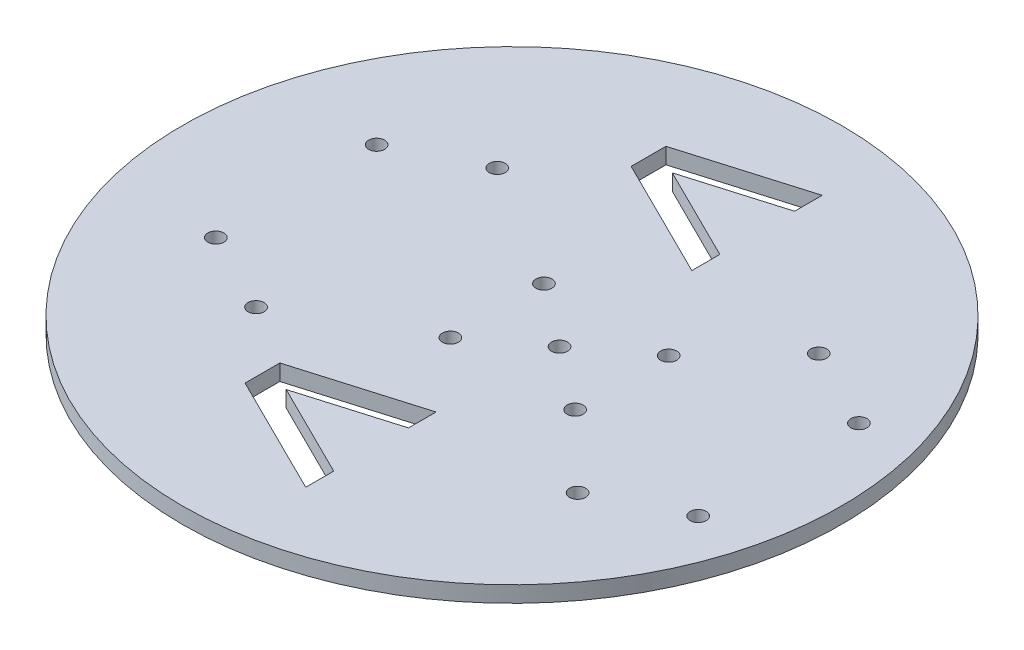
ISO-10303-21;
HEADER;
FILE_DESCRIPTION(('STEP AP214'),'2;1');
FILE_NAME('part.step','',(''),(''),'','','');
FILE_SCHEMA(('AUTOMOTIVE_DESIGN { 1 0 10303 214 1 1 1 1 }'));
ENDSEC;
DATA;
#1=APPLICATION_CONTEXT('core data for automotive mechanical design processes');
#2=APPLICATION_PROTOCOL_DEFINITION('international standard','automotive_design',2000,#1);
#3=PRODUCT_CONTEXT('',#1,'mechanical');
#4=PRODUCT('Part','Part','',(#3));
#5=PRODUCT_RELATED_PRODUCT_CATEGORY('part','',(#4));
#6=PRODUCT_DEFINITION_FORMATION('','',#4);
#7=PRODUCT_DEFINITION_CONTEXT('part definition',#1,'design');
#8=PRODUCT_DEFINITION('design','',#6,#7);
#9=PRODUCT_DEFINITION_SHAPE('','',#8);
#10=(LENGTH_UNIT() NAMED_UNIT(*) SI_UNIT(.MILLI.,.METRE.));
#11=(NAMED_UNIT(*) PLANE_ANGLE_UNIT() SI_UNIT($,.RADIAN.));
#12=(NAMED_UNIT(*) SI_UNIT($,.STERADIAN.) SOLID_ANGLE_UNIT());
#13=UNCERTAINTY_MEASURE_WITH_UNIT(LENGTH_MEASURE(1.E-05),#10,'distance_accuracy_value','');
#14=(GEOMETRIC_REPRESENTATION_CONTEXT(3) GLOBAL_UNCERTAINTY_ASSIGNED_CONTEXT((#13)) GLOBAL_UNIT_ASSIGNED_CONTEXT((#10,
#11,#12)) REPRESENTATION_CONTEXT('',''));
#15=CARTESIAN_POINT('',(0.,0.,0.));
#16=DIRECTION('',(0.,0.,1.));
#17=DIRECTION('',(1.,0.,0.));
#18=AXIS2_PLACEMENT_3D('',#15,#16,#17);
#19=CARTESIAN_POINT('',(0.,-2.,0.));
#20=DIRECTION('',(0.,-1.,0.));
#21=DIRECTION('',(0.,0.,-1.));
#22=AXIS2_PLACEMENT_3D('',#19,#20,#21);
#23=PLANE('',#22);
#24=CARTESIAN_POINT('',(21.7749811776247,-2.,-10.8921949784528));
#25=DIRECTION('',(0.,1.,0.));
#26=DIRECTION('',(0.,0.,1.));
#27=AXIS2_PLACEMENT_3D('',#24,#25,#26);
#28=CIRCLE('',#27,2.);
#29=CARTESIAN_POINT('',(21.7749811776247,-2.,-8.89219497845279));
#30=VERTEX_POINT('',#29);
#31=EDGE_CURVE('E409',#30,#30,#28,.T.);
#32=ORIENTED_EDGE('',*,*,#31,.T.);
#33=EDGE_LOOP('',(#32));
#34=FACE_BOUND('',#33,.T.);
#35=CARTESIAN_POINT('',(6.2549811776247,-2.,0.747805021547199));
#36=DIRECTION('',(0.,1.,0.));
#37=DIRECTION('',(0.,0.,1.));
#38=AXIS2_PLACEMENT_3D('',#35,#36,#37);
#39=CIRCLE('',#38,1.99999999999998);
#40=CARTESIAN_POINT('',(6.2549811776247,-2.,2.74780502154718));
#41=VERTEX_POINT('',#40);
#42=EDGE_CURVE('E403',#41,#41,#39,.T.);
#43=ORIENTED_EDGE('',*,*,#42,.T.);
#44=EDGE_LOOP('',(#43));
#45=FACE_BOUND('',#44,.T.);
#46=CARTESIAN_POINT('',(-9.26501882237527,-2.,12.3878050215472));
#47=DIRECTION('',(0.,1.,0.));
#48=DIRECTION('',(0.,0.,1.));
#49=AXIS2_PLACEMENT_3D('',#46,#47,#48);
#50=CIRCLE('',#49,2.);
#51=CARTESIAN_POINT('',(-9.26501882237527,-2.,14.3878050215472));
#52=VERTEX_POINT('',#51);
#53=EDGE_CURVE('E397',#52,#52,#50,.T.);
#54=ORIENTED_EDGE('',*,*,#53,.T.);
#55=EDGE_LOOP('',(#54));
#56=FACE_BOUND('',#55,.T.);
#57=CARTESIAN_POINT('',(-9.26501882237532,-2.,-10.8921949784528));
#58=DIRECTION('',(0.,1.,0.));
#59=DIRECTION('',(0.,0.,1.));
#60=AXIS2_PLACEMENT_3D('',#57,#58,#59);
#61=CIRCLE('',#60,2.);
#62=CARTESIAN_POINT('',(-9.26501882237532,-2.,-8.89219497845283));
#63=VERTEX_POINT('',#62);
#64=EDGE_CURVE('E384',#63,#63,#61,.T.);
#65=ORIENTED_EDGE('',*,*,#64,.T.);
#66=EDGE_LOOP('',(#65));
#67=FACE_BOUND('',#66,.T.);
#68=CARTESIAN_POINT('',(21.7749811776247,-2.,12.3878050215472));
#69=DIRECTION('',(0.,1.,0.));
#70=DIRECTION('',(0.,0.,1.));
#71=AXIS2_PLACEMENT_3D('',#68,#69,#70);
#72=CIRCLE('',#71,2.);
#73=CARTESIAN_POINT('',(21.7749811776247,-2.,14.3878050215472));
#74=VERTEX_POINT('',#73);
#75=EDGE_CURVE('E392',#74,#74,#72,.T.);
#76=ORIENTED_EDGE('',*,*,#75,.T.);
#77=EDGE_LOOP('',(#76));
#78=FACE_BOUND('',#77,.T.);
#79=CARTESIAN_POINT('',(-40.,-2.,30.));
#80=DIRECTION('',(0.,1.,0.));
#81=DIRECTION('',(0.,0.,1.));
#82=AXIS2_PLACEMENT_3D('',#79,#80,#81);
#83=CIRCLE('',#82,2.);
#84=CARTESIAN_POINT('',(-40.,-2.,32.));
#85=VERTEX_POINT('',#84);
#86=EDGE_CURVE('E416',#85,#85,#83,.T.);
#87=ORIENTED_EDGE('',*,*,#86,.T.);
#88=EDGE_LOOP('',(#87));
#89=FACE_BOUND('',#88,.T.);
#90=CARTESIAN_POINT('',(40.,-2.,30.));
#91=DIRECTION('',(0.,1.,0.));
#92=DIRECTION('',(0.,0.,1.));
#93=AXIS2_PLACEMENT_3D('',#90,#91,#92);
#94=CIRCLE('',#93,2.);
#95=CARTESIAN_POINT('',(40.,-2.,32.));
#96=VERTEX_POINT('',#95);
#97=EDGE_CURVE('E425',#96,#96,#94,.T.);
#98=ORIENTED_EDGE('',*,*,#97,.T.);
#99=EDGE_LOOP('',(#98));
#100=FACE_BOUND('',#99,.T.);
#101=CARTESIAN_POINT('',(40.,-2.,-30.));
#102=DIRECTION('',(0.,1.,0.));
#103=DIRECTION('',(0.,0.,1.));
#104=AXIS2_PLACEMENT_3D('',#101,#102,#103);
#105=CIRCLE('',#104,2.);
#106=CARTESIAN_POINT('',(40.,-2.,-28.));
#107=VERTEX_POINT('',#106);
#108=EDGE_CURVE('E417',#107,#107,#105,.T.);
#109=ORIENTED_EDGE('',*,*,#108,.T.);
#110=EDGE_LOOP('',(#109));
#111=FACE_BOUND('',#110,.T.);
#112=CARTESIAN_POINT('',(-40.,-2.,-30.));
#113=DIRECTION('',(0.,1.,0.));
#114=DIRECTION('',(0.,0.,1.));
#115=AXIS2_PLACEMENT_3D('',#112,#113,#114);
#116=CIRCLE('',#115,2.);
#117=CARTESIAN_POINT('',(-40.,-2.,-28.));
#118=VERTEX_POINT('',#117);
#119=EDGE_CURVE('E437',#118,#118,#116,.T.);
#120=ORIENTED_EDGE('',*,*,#119,.T.);
#121=EDGE_LOOP('',(#120));
#122=FACE_BOUND('',#121,.T.);
#123=CARTESIAN_POINT('',(59.9999999999999,-2.,-20.));
#124=DIRECTION('',(0.,1.,0.));
#125=DIRECTION('',(0.,0.,1.));
#126=AXIS2_PLACEMENT_3D('',#123,#124,#125);
#127=CIRCLE('',#126,2.);
#128=CARTESIAN_POINT('',(59.9999999999999,-2.,-18.));
#129=VERTEX_POINT('',#128);
#130=EDGE_CURVE('E440',#129,#129,#127,.T.);
#131=ORIENTED_EDGE('',*,*,#130,.T.);
#132=EDGE_LOOP('',(#131));
#133=FACE_BOUND('',#132,.T.);
#134=CARTESIAN_POINT('',(-59.9999999999999,-2.,20.));
#135=DIRECTION('',(0.,1.,0.));
#136=DIRECTION('',(0.,0.,1.));
#137=AXIS2_PLACEMENT_3D('',#134,#135,#136);
#138=CIRCLE('',#137,2.);
#139=CARTESIAN_POINT('',(-59.9999999999999,-2.,22.));
#140=VERTEX_POINT('',#139);
#141=EDGE_CURVE('E454',#140,#140,#138,.T.);
#142=ORIENTED_EDGE('',*,*,#141,.T.);
#143=EDGE_LOOP('',(#142));
#144=FACE_BOUND('',#143,.T.);
#145=CARTESIAN_POINT('',(-60.0000000000001,-2.,-20.));
#146=DIRECTION('',(0.,1.,0.));
#147=DIRECTION('',(0.,0.,1.));
#148=AXIS2_PLACEMENT_3D('',#145,#146,#147);
#149=CIRCLE('',#148,2.);
#150=CARTESIAN_POINT('',(-60.0000000000001,-2.,-18.));
#151=VERTEX_POINT('',#150);
#152=EDGE_CURVE('E447',#151,#151,#149,.T.);
#153=ORIENTED_EDGE('',*,*,#152,.T.);
#154=EDGE_LOOP('',(#153));
#155=FACE_BOUND('',#154,.T.);
#156=CARTESIAN_POINT('',(60.0000000000001,-2.,20.));
#157=DIRECTION('',(0.,1.,0.));
#158=DIRECTION('',(0.,0.,1.));
#159=AXIS2_PLACEMENT_3D('',#156,#157,#158);
#160=CIRCLE('',#159,2.);
#161=CARTESIAN_POINT('',(60.0000000000001,-2.,22.));
#162=VERTEX_POINT('',#161);
#163=EDGE_CURVE('E446',#162,#162,#160,.T.);
#164=ORIENTED_EDGE('',*,*,#163,.T.);
#165=EDGE_LOOP('',(#164));
#166=FACE_BOUND('',#165,.T.);
#167=DIRECTION('',(0.,0.,-1.));
#168=VECTOR('',#167,1.);
#169=CARTESIAN_POINT('',(6.32515331946339,-2.,-57.6744622794833));
#170=LINE('',#169,#168);
#171=CARTESIAN_POINT('',(6.32515331946339,-2.,-57.6744622794833));
#172=VERTEX_POINT('',#171);
#173=CARTESIAN_POINT('',(6.32515331946339,-2.,-64.5351326963127));
#174=VERTEX_POINT('',#173);
#175=EDGE_CURVE('E180',#172,#174,#170,.T.);
#176=ORIENTED_EDGE('',*,*,#175,.T.);
#177=DIRECTION('',(-0.958969579416232,0.,0.283508987078461));
#178=VECTOR('',#177,1.);
#179=CARTESIAN_POINT('',(6.32515331946339,-2.,-64.5351326963127));
#180=LINE('',#179,#178);
#181=CARTESIAN_POINT('',(-23.6777707947063,-2.,-55.6650925953762));
#182=VERTEX_POINT('',#181);
#183=EDGE_CURVE('E183',#174,#182,#180,.T.);
#184=ORIENTED_EDGE('',*,*,#183,.T.);
#185=DIRECTION('',(0.,0.,1.));
#186=VECTOR('',#185,1.);
#187=CARTESIAN_POINT('',(-23.6777707947063,-2.,-55.6650925953762));
#188=LINE('',#187,#186);
#189=CARTESIAN_POINT('',(-23.6777707947063,-2.,-47.0022729422069));
#190=VERTEX_POINT('',#189);
#191=EDGE_CURVE('E58',#182,#190,#188,.T.);
#192=ORIENTED_EDGE('',*,*,#191,.T.);
#193=DIRECTION('',(0.89556414148049,0.,0.444932431380669));
#194=VECTOR('',#193,1.);
#195=CARTESIAN_POINT('',(-23.6777707947063,-2.,-47.0022729422069));
#196=LINE('',#195,#194);
#197=CARTESIAN_POINT('',(6.32515331946339,-2.,-32.0962786573318));
#198=VERTEX_POINT('',#197);
#199=EDGE_CURVE('E186',#190,#198,#196,.T.);
#200=ORIENTED_EDGE('',*,*,#199,.T.);
#201=DIRECTION('',(0.,0.,-1.));
#202=VECTOR('',#201,1.);
#203=CARTESIAN_POINT('',(6.32515331946339,-2.,-32.0962786573318));
#204=LINE('',#203,#202);
#205=CARTESIAN_POINT('',(6.32515331946338,-2.,-39.0619101087721));
#206=VERTEX_POINT('',#205);
#207=EDGE_CURVE('E189',#198,#206,#204,.T.);
#208=ORIENTED_EDGE('',*,*,#207,.T.);
#209=DIRECTION('',(-0.895564141480489,0.,-0.444932431380669));
#210=VECTOR('',#209,1.);
#211=CARTESIAN_POINT('',(6.32515331946338,-2.,-39.0619101087721));
#212=LINE('',#211,#210);
#213=CARTESIAN_POINT('',(-17.1619842446594,-2.,-50.7307440186491));
#214=VERTEX_POINT('',#213);
#215=EDGE_CURVE('E192',#206,#214,#212,.T.);
#216=ORIENTED_EDGE('',*,*,#215,.T.);
#217=DIRECTION('',(0.958969579416232,0.,-0.283508987078461));
#218=VECTOR('',#217,1.);
#219=CARTESIAN_POINT('',(-17.1619842446594,-2.,-50.7307440186491));
#220=LINE('',#219,#218);
#221=EDGE_CURVE('E195',#214,#172,#220,.T.);
#222=ORIENTED_EDGE('',*,*,#221,.T.);
#223=EDGE_LOOP('',(#176,#184,#192,#200,#208,#216,#222));
#224=FACE_BOUND('',#223,.T.);
#225=DIRECTION('',(0.,0.,-1.));
#226=VECTOR('',#225,1.);
#227=CARTESIAN_POINT('',(4.98159118714532,-2.,37.0507918476206));
#228=LINE('',#227,#226);
#229=CARTESIAN_POINT('',(4.98159118714532,-2.,37.0507918476206));
#230=VERTEX_POINT('',#229);
#231=CARTESIAN_POINT('',(4.98159118714532,-2.,30.1901214307911));
#232=VERTEX_POINT('',#231);
#233=EDGE_CURVE('E240',#230,#232,#228,.T.);
#234=ORIENTED_EDGE('',*,*,#233,.T.);
#235=DIRECTION('',(-0.958969579416232,0.,0.283508987078461));
#236=VECTOR('',#235,1.);
#237=CARTESIAN_POINT('',(4.98159118714532,-2.,30.1901214307911));
#238=LINE('',#237,#236);
#239=CARTESIAN_POINT('',(-25.0213329270244,-2.,39.0601615317277));
#240=VERTEX_POINT('',#239);
#241=EDGE_CURVE('E237',#232,#240,#238,.T.);
#242=ORIENTED_EDGE('',*,*,#241,.T.);
#243=DIRECTION('',(0.,0.,1.));
#244=VECTOR('',#243,1.);
#245=CARTESIAN_POINT('',(-25.0213329270244,-2.,39.0601615317277));
#246=LINE('',#245,#244);
#247=CARTESIAN_POINT('',(-25.0213329270244,-2.,47.722981184897));
#248=VERTEX_POINT('',#247);
#249=EDGE_CURVE('E66',#240,#248,#246,.T.);
#250=ORIENTED_EDGE('',*,*,#249,.T.);
#251=DIRECTION('',(0.89556414148049,0.,0.444932431380669));
#252=VECTOR('',#251,1.);
#253=CARTESIAN_POINT('',(-25.0213329270244,-2.,47.722981184897));
#254=LINE('',#253,#252);
#255=CARTESIAN_POINT('',(4.98159118714533,-2.,62.6289754697721));
#256=VERTEX_POINT('',#255);
#257=EDGE_CURVE('E233',#248,#256,#254,.T.);
#258=ORIENTED_EDGE('',*,*,#257,.T.);
#259=DIRECTION('',(0.,0.,-1.));
#260=VECTOR('',#259,1.);
#261=CARTESIAN_POINT('',(4.98159118714533,-2.,62.6289754697721));
#262=LINE('',#261,#260);
#263=CARTESIAN_POINT('',(4.98159118714532,-2.,55.6633440183317));
#264=VERTEX_POINT('',#263);
#265=EDGE_CURVE('E230',#256,#264,#262,.T.);
#266=ORIENTED_EDGE('',*,*,#265,.T.);
#267=DIRECTION('',(-0.89556414148049,0.,-0.444932431380669));
#268=VECTOR('',#267,1.);
#269=CARTESIAN_POINT('',(4.98159118714532,-2.,55.6633440183317));
#270=LINE('',#269,#268);
#271=CARTESIAN_POINT('',(-18.5055463769775,-2.,43.9945101084548));
#272=VERTEX_POINT('',#271);
#273=EDGE_CURVE('E227',#264,#272,#270,.T.);
#274=ORIENTED_EDGE('',*,*,#273,.T.);
#275=DIRECTION('',(0.958969579416232,0.,-0.283508987078461));
#276=VECTOR('',#275,1.);
#277=CARTESIAN_POINT('',(-18.5055463769775,-2.,43.9945101084548));
#278=LINE('',#277,#276);
#279=EDGE_CURVE('E211',#272,#230,#278,.T.);
#280=ORIENTED_EDGE('',*,*,#279,.T.);
#281=EDGE_LOOP('',(#234,#242,#250,#258,#266,#274,#280));
#282=FACE_BOUND('',#281,.T.);
#283=CARTESIAN_POINT('',(-6.31992991000001,-2.,0.));
#284=DIRECTION('',(0.,1.,0.));
#285=DIRECTION('',(0.,0.,1.));
#286=AXIS2_PLACEMENT_3D('',#283,#284,#285);
#287=CIRCLE('',#286,82.);
#288=CARTESIAN_POINT('',(-6.31992991000001,-2.,82.));
#289=VERTEX_POINT('',#288);
#290=EDGE_CURVE('E12',#289,#289,#287,.T.);
#291=ORIENTED_EDGE('',*,*,#290,.F.);
#292=EDGE_LOOP('',(#291));
#293=FACE_BOUND('',#292,.T.);
#294=ADVANCED_FACE('F44',(#34,#45,#56,#67,#78,#89,#100,#111,#122,#133,#144,#155,#166,#224,#282,
#293),#23,.T.);
#295=CARTESIAN_POINT('',(-6.31992991000001,-2.,0.));
#296=DIRECTION('',(0.,1.,0.));
#297=DIRECTION('',(0.,0.,1.));
#298=AXIS2_PLACEMENT_3D('',#295,#296,#297);
#299=CYLINDRICAL_SURFACE('',#298,82.);
#300=ORIENTED_EDGE('',*,*,#290,.T.);
#301=EDGE_LOOP('',(#300));
#302=FACE_BOUND('',#301,.T.);
#303=CARTESIAN_POINT('',(-6.31992991000001,2.,0.));
#304=DIRECTION('',(0.,1.,0.));
#305=DIRECTION('',(0.,0.,1.));
#306=AXIS2_PLACEMENT_3D('',#303,#304,#305);
#307=CIRCLE('',#306,82.);
#308=CARTESIAN_POINT('',(-6.31992991000001,2.,82.));
#309=VERTEX_POINT('',#308);
#310=EDGE_CURVE('E51',#309,#309,#307,.T.);
#311=ORIENTED_EDGE('',*,*,#310,.F.);
#312=EDGE_LOOP('',(#311));
#313=FACE_BOUND('',#312,.T.);
#314=ADVANCED_FACE('F266',(#302,#313),#299,.T.);
#315=CARTESIAN_POINT('',(0.,2.,0.));
#316=DIRECTION('',(0.,-1.,0.));
#317=DIRECTION('',(0.,0.,-1.));
#318=AXIS2_PLACEMENT_3D('',#315,#316,#317);
#319=PLANE('',#318);
#320=CARTESIAN_POINT('',(21.7749811776247,2.,-10.8921949784528));
#321=DIRECTION('',(0.,1.,0.));
#322=DIRECTION('',(0.,0.,1.));
#323=AXIS2_PLACEMENT_3D('',#320,#321,#322);
#324=CIRCLE('',#323,2.);
#325=CARTESIAN_POINT('',(21.7749811776247,2.,-8.89219497845279));
#326=VERTEX_POINT('',#325);
#327=EDGE_CURVE('E406',#326,#326,#324,.T.);
#328=ORIENTED_EDGE('',*,*,#327,.F.);
#329=EDGE_LOOP('',(#328));
#330=FACE_BOUND('',#329,.T.);
#331=CARTESIAN_POINT('',(6.2549811776247,2.,0.747805021547199));
#332=DIRECTION('',(0.,1.,0.));
#333=DIRECTION('',(0.,0.,1.));
#334=AXIS2_PLACEMENT_3D('',#331,#332,#333);
#335=CIRCLE('',#334,1.99999999999998);
#336=CARTESIAN_POINT('',(6.2549811776247,2.,2.74780502154718));
#337=VERTEX_POINT('',#336);
#338=EDGE_CURVE('E400',#337,#337,#335,.T.);
#339=ORIENTED_EDGE('',*,*,#338,.F.);
#340=EDGE_LOOP('',(#339));
#341=FACE_BOUND('',#340,.T.);
#342=CARTESIAN_POINT('',(-9.26501882237527,2.,12.3878050215472));
#343=DIRECTION('',(0.,1.,0.));
#344=DIRECTION('',(0.,0.,1.));
#345=AXIS2_PLACEMENT_3D('',#342,#343,#344);
#346=CIRCLE('',#345,2.);
#347=CARTESIAN_POINT('',(-9.26501882237527,2.,14.3878050215472));
#348=VERTEX_POINT('',#347);
#349=EDGE_CURVE('E394',#348,#348,#346,.T.);
#350=ORIENTED_EDGE('',*,*,#349,.F.);
#351=EDGE_LOOP('',(#350));
#352=FACE_BOUND('',#351,.T.);
#353=CARTESIAN_POINT('',(-9.26501882237532,2.,-10.8921949784528));
#354=DIRECTION('',(0.,1.,0.));
#355=DIRECTION('',(0.,0.,1.));
#356=AXIS2_PLACEMENT_3D('',#353,#354,#355);
#357=CIRCLE('',#356,2.);
#358=CARTESIAN_POINT('',(-9.26501882237532,2.,-8.89219497845283));
#359=VERTEX_POINT('',#358);
#360=EDGE_CURVE('E387',#359,#359,#357,.T.);
#361=ORIENTED_EDGE('',*,*,#360,.F.);
#362=EDGE_LOOP('',(#361));
#363=FACE_BOUND('',#362,.T.);
#364=CARTESIAN_POINT('',(21.7749811776247,2.,12.3878050215472));
#365=DIRECTION('',(0.,1.,0.));
#366=DIRECTION('',(0.,0.,1.));
#367=AXIS2_PLACEMENT_3D('',#364,#365,#366);
#368=CIRCLE('',#367,2.);
#369=CARTESIAN_POINT('',(21.7749811776247,2.,14.3878050215472));
#370=VERTEX_POINT('',#369);
#371=EDGE_CURVE('E389',#370,#370,#368,.T.);
#372=ORIENTED_EDGE('',*,*,#371,.F.);
#373=EDGE_LOOP('',(#372));
#374=FACE_BOUND('',#373,.T.);
#375=CARTESIAN_POINT('',(-40.,2.,30.));
#376=DIRECTION('',(0.,1.,0.));
#377=DIRECTION('',(0.,0.,1.));
#378=AXIS2_PLACEMENT_3D('',#375,#376,#377);
#379=CIRCLE('',#378,2.);
#380=CARTESIAN_POINT('',(-40.,2.,32.));
#381=VERTEX_POINT('',#380);
#382=EDGE_CURVE('E428',#381,#381,#379,.T.);
#383=ORIENTED_EDGE('',*,*,#382,.F.);
#384=EDGE_LOOP('',(#383));
#385=FACE_BOUND('',#384,.T.);
#386=CARTESIAN_POINT('',(40.,2.,30.));
#387=DIRECTION('',(0.,1.,0.));
#388=DIRECTION('',(0.,0.,1.));
#389=AXIS2_PLACEMENT_3D('',#386,#387,#388);
#390=CIRCLE('',#389,2.);
#391=CARTESIAN_POINT('',(40.,2.,32.));
#392=VERTEX_POINT('',#391);
#393=EDGE_CURVE('E421',#392,#392,#390,.T.);
#394=ORIENTED_EDGE('',*,*,#393,.F.);
#395=EDGE_LOOP('',(#394));
#396=FACE_BOUND('',#395,.T.);
#397=CARTESIAN_POINT('',(40.,2.,-30.));
#398=DIRECTION('',(0.,1.,0.));
#399=DIRECTION('',(0.,0.,1.));
#400=AXIS2_PLACEMENT_3D('',#397,#398,#399);
#401=CIRCLE('',#400,2.);
#402=CARTESIAN_POINT('',(40.,2.,-28.));
#403=VERTEX_POINT('',#402);
#404=EDGE_CURVE('E420',#403,#403,#401,.T.);
#405=ORIENTED_EDGE('',*,*,#404,.F.);
#406=EDGE_LOOP('',(#405));
#407=FACE_BOUND('',#406,.T.);
#408=CARTESIAN_POINT('',(-40.,2.,-30.));
#409=DIRECTION('',(0.,1.,0.));
#410=DIRECTION('',(0.,0.,1.));
#411=AXIS2_PLACEMENT_3D('',#408,#409,#410);
#412=CIRCLE('',#411,2.);
#413=CARTESIAN_POINT('',(-40.,2.,-28.));
#414=VERTEX_POINT('',#413);
#415=EDGE_CURVE('E424',#414,#414,#412,.T.);
#416=ORIENTED_EDGE('',*,*,#415,.F.);
#417=EDGE_LOOP('',(#416));
#418=FACE_BOUND('',#417,.T.);
#419=CARTESIAN_POINT('',(59.9999999999999,2.,-20.));
#420=DIRECTION('',(0.,1.,0.));
#421=DIRECTION('',(0.,0.,1.));
#422=AXIS2_PLACEMENT_3D('',#419,#420,#421);
#423=CIRCLE('',#422,2.);
#424=CARTESIAN_POINT('',(59.9999999999999,2.,-18.));
#425=VERTEX_POINT('',#424);
#426=EDGE_CURVE('E443',#425,#425,#423,.T.);
#427=ORIENTED_EDGE('',*,*,#426,.F.);
#428=EDGE_LOOP('',(#427));
#429=FACE_BOUND('',#428,.T.);
#430=CARTESIAN_POINT('',(-59.9999999999999,2.,20.));
#431=DIRECTION('',(0.,1.,0.));
#432=DIRECTION('',(0.,0.,1.));
#433=AXIS2_PLACEMENT_3D('',#430,#431,#432);
#434=CIRCLE('',#433,2.);
#435=CARTESIAN_POINT('',(-59.9999999999999,2.,22.));
#436=VERTEX_POINT('',#435);
#437=EDGE_CURVE('E224',#436,#436,#434,.T.);
#438=ORIENTED_EDGE('',*,*,#437,.F.);
#439=EDGE_LOOP('',(#438));
#440=FACE_BOUND('',#439,.T.);
#441=CARTESIAN_POINT('',(-60.0000000000001,2.,-20.));
#442=DIRECTION('',(0.,1.,0.));
#443=DIRECTION('',(0.,0.,1.));
#444=AXIS2_PLACEMENT_3D('',#441,#442,#443);
#445=CIRCLE('',#444,2.);
#446=CARTESIAN_POINT('',(-60.0000000000001,2.,-18.));
#447=VERTEX_POINT('',#446);
#448=EDGE_CURVE('E450',#447,#447,#445,.T.);
#449=ORIENTED_EDGE('',*,*,#448,.F.);
#450=EDGE_LOOP('',(#449));
#451=FACE_BOUND('',#450,.T.);
#452=CARTESIAN_POINT('',(60.0000000000001,2.,20.));
#453=DIRECTION('',(0.,1.,0.));
#454=DIRECTION('',(0.,0.,1.));
#455=AXIS2_PLACEMENT_3D('',#452,#453,#454);
#456=CIRCLE('',#455,2.);
#457=CARTESIAN_POINT('',(60.0000000000001,2.,22.));
#458=VERTEX_POINT('',#457);
#459=EDGE_CURVE('E451',#458,#458,#456,.T.);
#460=ORIENTED_EDGE('',*,*,#459,.F.);
#461=EDGE_LOOP('',(#460));
#462=FACE_BOUND('',#461,.T.);
#463=DIRECTION('',(-0.958969579416232,0.,0.283508987078461));
#464=VECTOR('',#463,1.);
#465=CARTESIAN_POINT('',(6.32515331946339,2.,-64.5351326963127));
#466=LINE('',#465,#464);
#467=CARTESIAN_POINT('',(6.32515331946339,2.,-64.5351326963127));
#468=VERTEX_POINT('',#467);
#469=CARTESIAN_POINT('',(-23.6777707947063,2.,-55.6650925953762));
#470=VERTEX_POINT('',#469);
#471=EDGE_CURVE('E156',#468,#470,#466,.T.);
#472=ORIENTED_EDGE('',*,*,#471,.F.);
#473=DIRECTION('',(0.,0.,-1.));
#474=VECTOR('',#473,1.);
#475=CARTESIAN_POINT('',(6.32515331946339,2.,-57.6744622794833));
#476=LINE('',#475,#474);
#477=CARTESIAN_POINT('',(6.32515331946339,2.,-57.6744622794833));
#478=VERTEX_POINT('',#477);
#479=EDGE_CURVE('E160',#478,#468,#476,.T.);
#480=ORIENTED_EDGE('',*,*,#479,.F.);
#481=DIRECTION('',(0.958969579416232,0.,-0.283508987078461));
#482=VECTOR('',#481,1.);
#483=CARTESIAN_POINT('',(-17.1619842446594,2.,-50.7307440186491));
#484=LINE('',#483,#482);
#485=CARTESIAN_POINT('',(-17.1619842446594,2.,-50.7307440186491));
#486=VERTEX_POINT('',#485);
#487=EDGE_CURVE('E177',#486,#478,#484,.T.);
#488=ORIENTED_EDGE('',*,*,#487,.F.);
#489=DIRECTION('',(-0.895564141480489,0.,-0.444932431380669));
#490=VECTOR('',#489,1.);
#491=CARTESIAN_POINT('',(6.32515331946338,2.,-39.0619101087721));
#492=LINE('',#491,#490);
#493=CARTESIAN_POINT('',(6.32515331946338,2.,-39.0619101087721));
#494=VERTEX_POINT('',#493);
#495=EDGE_CURVE('E174',#494,#486,#492,.T.);
#496=ORIENTED_EDGE('',*,*,#495,.F.);
#497=DIRECTION('',(0.,0.,-1.));
#498=VECTOR('',#497,1.);
#499=CARTESIAN_POINT('',(6.32515331946339,2.,-32.0962786573318));
#500=LINE('',#499,#498);
#501=CARTESIAN_POINT('',(6.32515331946339,2.,-32.0962786573318));
#502=VERTEX_POINT('',#501);
#503=EDGE_CURVE('E168',#502,#494,#500,.T.);
#504=ORIENTED_EDGE('',*,*,#503,.F.);
#505=DIRECTION('',(0.89556414148049,0.,0.444932431380669));
#506=VECTOR('',#505,1.);
#507=CARTESIAN_POINT('',(-23.6777707947063,2.,-47.0022729422069));
#508=LINE('',#507,#506);
#509=CARTESIAN_POINT('',(-23.6777707947063,2.,-47.0022729422069));
#510=VERTEX_POINT('',#509);
#511=EDGE_CURVE('E166',#510,#502,#508,.T.);
#512=ORIENTED_EDGE('',*,*,#511,.F.);
#513=DIRECTION('',(0.,0.,1.));
#514=VECTOR('',#513,1.);
#515=CARTESIAN_POINT('',(-23.6777707947063,2.,-55.6650925953762));
#516=LINE('',#515,#514);
#517=EDGE_CURVE('E146',#470,#510,#516,.T.);
#518=ORIENTED_EDGE('',*,*,#517,.F.);
#519=EDGE_LOOP('',(#472,#480,#488,#496,#504,#512,#518));
#520=FACE_BOUND('',#519,.T.);
#521=DIRECTION('',(-0.958969579416232,0.,0.283508987078461));
#522=VECTOR('',#521,1.);
#523=CARTESIAN_POINT('',(4.98159118714532,2.,30.1901214307911));
#524=LINE('',#523,#522);
#525=CARTESIAN_POINT('',(4.98159118714532,2.,30.1901214307911));
#526=VERTEX_POINT('',#525);
#527=CARTESIAN_POINT('',(-25.0213329270244,2.,39.0601615317277));
#528=VERTEX_POINT('',#527);
#529=EDGE_CURVE('E258',#526,#528,#524,.T.);
#530=ORIENTED_EDGE('',*,*,#529,.F.);
#531=DIRECTION('',(0.,0.,-1.));
#532=VECTOR('',#531,1.);
#533=CARTESIAN_POINT('',(4.98159118714532,2.,37.0507918476206));
#534=LINE('',#533,#532);
#535=CARTESIAN_POINT('',(4.98159118714532,2.,37.0507918476206));
#536=VERTEX_POINT('',#535);
#537=EDGE_CURVE('E261',#536,#526,#534,.T.);
#538=ORIENTED_EDGE('',*,*,#537,.F.);
#539=DIRECTION('',(0.958969579416232,0.,-0.283508987078461));
#540=VECTOR('',#539,1.);
#541=CARTESIAN_POINT('',(-18.5055463769775,2.,43.9945101084548));
#542=LINE('',#541,#540);
#543=CARTESIAN_POINT('',(-18.5055463769775,2.,43.9945101084548));
#544=VERTEX_POINT('',#543);
#545=EDGE_CURVE('E243',#544,#536,#542,.T.);
#546=ORIENTED_EDGE('',*,*,#545,.F.);
#547=DIRECTION('',(-0.89556414148049,0.,-0.444932431380669));
#548=VECTOR('',#547,1.);
#549=CARTESIAN_POINT('',(4.98159118714532,2.,55.6633440183317));
#550=LINE('',#549,#548);
#551=CARTESIAN_POINT('',(4.98159118714532,2.,55.6633440183317));
#552=VERTEX_POINT('',#551);
#553=EDGE_CURVE('E246',#552,#544,#550,.T.);
#554=ORIENTED_EDGE('',*,*,#553,.F.);
#555=DIRECTION('',(0.,0.,-1.));
#556=VECTOR('',#555,1.);
#557=CARTESIAN_POINT('',(4.98159118714533,2.,62.6289754697721));
#558=LINE('',#557,#556);
#559=CARTESIAN_POINT('',(4.98159118714533,2.,62.6289754697721));
#560=VERTEX_POINT('',#559);
#561=EDGE_CURVE('E249',#560,#552,#558,.T.);
#562=ORIENTED_EDGE('',*,*,#561,.F.);
#563=DIRECTION('',(0.89556414148049,0.,0.444932431380669));
#564=VECTOR('',#563,1.);
#565=CARTESIAN_POINT('',(-25.0213329270244,2.,47.722981184897));
#566=LINE('',#565,#564);
#567=CARTESIAN_POINT('',(-25.0213329270244,2.,47.722981184897));
#568=VERTEX_POINT('',#567);
#569=EDGE_CURVE('E252',#568,#560,#566,.T.);
#570=ORIENTED_EDGE('',*,*,#569,.F.);
#571=DIRECTION('',(0.,0.,1.));
#572=VECTOR('',#571,1.);
#573=CARTESIAN_POINT('',(-25.0213329270244,2.,39.0601615317277));
#574=LINE('',#573,#572);
#575=EDGE_CURVE('E255',#528,#568,#574,.T.);
#576=ORIENTED_EDGE('',*,*,#575,.F.);
#577=EDGE_LOOP('',(#530,#538,#546,#554,#562,#570,#576));
#578=FACE_BOUND('',#577,.T.);
#579=ORIENTED_EDGE('',*,*,#310,.T.);
#580=EDGE_LOOP('',(#579));
#581=FACE_BOUND('',#580,.T.);
#582=ADVANCED_FACE('F162',(#330,#341,#352,#363,#374,#385,#396,#407,#418,#429,#440,#451,#462,
#520,#578,#581),#319,.F.);
#583=CARTESIAN_POINT('',(4.98159118714532,-2.,37.0507918476206));
#584=DIRECTION('',(1.,0.,0.));
#585=DIRECTION('',(0.,0.,-1.));
#586=AXIS2_PLACEMENT_3D('',#583,#584,#585);
#587=PLANE('',#586);
#588=DIRECTION('',(0.,1.,0.));
#589=VECTOR('',#588,1.);
#590=CARTESIAN_POINT('',(4.98159118714532,-2.,30.1901214307911));
#591=LINE('',#590,#589);
#592=EDGE_CURVE('E208',#232,#526,#591,.T.);
#593=ORIENTED_EDGE('',*,*,#592,.F.);
#594=ORIENTED_EDGE('',*,*,#233,.F.);
#595=DIRECTION('',(0.,1.,0.));
#596=VECTOR('',#595,1.);
#597=CARTESIAN_POINT('',(4.98159118714532,-2.,37.0507918476206));
#598=LINE('',#597,#596);
#599=EDGE_CURVE('E222',#230,#536,#598,.T.);
#600=ORIENTED_EDGE('',*,*,#599,.T.);
#601=ORIENTED_EDGE('',*,*,#537,.T.);
#602=EDGE_LOOP('',(#593,#594,#600,#601));
#603=FACE_BOUND('',#602,.T.);
#604=ADVANCED_FACE('F274',(#603),#587,.F.);
#605=CARTESIAN_POINT('',(-18.5055463769775,-2.,43.9945101084548));
#606=DIRECTION('',(0.283508987078461,0.,0.958969579416232));
#607=DIRECTION('',(0.958969579416232,0.,-0.283508987078461));
#608=AXIS2_PLACEMENT_3D('',#605,#606,#607);
#609=PLANE('',#608);
#610=ORIENTED_EDGE('',*,*,#599,.F.);
#611=ORIENTED_EDGE('',*,*,#279,.F.);
#612=DIRECTION('',(0.,1.,0.));
#613=VECTOR('',#612,1.);
#614=CARTESIAN_POINT('',(-18.5055463769775,-2.,43.9945101084548));
#615=LINE('',#614,#613);
#616=EDGE_CURVE('E220',#272,#544,#615,.T.);
#617=ORIENTED_EDGE('',*,*,#616,.T.);
#618=ORIENTED_EDGE('',*,*,#545,.T.);
#619=EDGE_LOOP('',(#610,#611,#617,#618));
#620=FACE_BOUND('',#619,.T.);
#621=ADVANCED_FACE('F278',(#620),#609,.F.);
#622=CARTESIAN_POINT('',(4.98159118714532,-2.,55.6633440183317));
#623=DIRECTION('',(0.444932431380669,0.,-0.89556414148049));
#624=DIRECTION('',(-0.89556414148049,0.,-0.444932431380669));
#625=AXIS2_PLACEMENT_3D('',#622,#623,#624);
#626=PLANE('',#625);
#627=ORIENTED_EDGE('',*,*,#616,.F.);
#628=ORIENTED_EDGE('',*,*,#273,.F.);
#629=DIRECTION('',(0.,1.,0.));
#630=VECTOR('',#629,1.);
#631=CARTESIAN_POINT('',(4.98159118714532,-2.,55.6633440183317));
#632=LINE('',#631,#630);
#633=EDGE_CURVE('E218',#264,#552,#632,.T.);
#634=ORIENTED_EDGE('',*,*,#633,.T.);
#635=ORIENTED_EDGE('',*,*,#553,.T.);
#636=EDGE_LOOP('',(#627,#628,#634,#635));
#637=FACE_BOUND('',#636,.T.);
#638=ADVANCED_FACE('F281',(#637),#626,.F.);
#639=CARTESIAN_POINT('',(4.98159118714533,-2.,62.6289754697721));
#640=DIRECTION('',(1.,0.,0.));
#641=DIRECTION('',(0.,0.,-1.));
#642=AXIS2_PLACEMENT_3D('',#639,#640,#641);
#643=PLANE('',#642);
#644=ORIENTED_EDGE('',*,*,#633,.F.);
#645=ORIENTED_EDGE('',*,*,#265,.F.);
#646=DIRECTION('',(0.,1.,0.));
#647=VECTOR('',#646,1.);
#648=CARTESIAN_POINT('',(4.98159118714533,-2.,62.6289754697721));
#649=LINE('',#648,#647);
#650=EDGE_CURVE('E216',#256,#560,#649,.T.);
#651=ORIENTED_EDGE('',*,*,#650,.T.);
#652=ORIENTED_EDGE('',*,*,#561,.T.);
#653=EDGE_LOOP('',(#644,#645,#651,#652));
#654=FACE_BOUND('',#653,.T.);
#655=ADVANCED_FACE('F285',(#654),#643,.F.);
#656=CARTESIAN_POINT('',(-25.0213329270244,-2.,47.722981184897));
#657=DIRECTION('',(-0.444932431380669,0.,0.89556414148049));
#658=DIRECTION('',(0.89556414148049,0.,0.444932431380669));
#659=AXIS2_PLACEMENT_3D('',#656,#657,#658);
#660=PLANE('',#659);
#661=ORIENTED_EDGE('',*,*,#650,.F.);
#662=ORIENTED_EDGE('',*,*,#257,.F.);
#663=DIRECTION('',(0.,1.,0.));
#664=VECTOR('',#663,1.);
#665=CARTESIAN_POINT('',(-25.0213329270244,-2.,47.722981184897));
#666=LINE('',#665,#664);
#667=EDGE_CURVE('E214',#248,#568,#666,.T.);
#668=ORIENTED_EDGE('',*,*,#667,.T.);
#669=ORIENTED_EDGE('',*,*,#569,.T.);
#670=EDGE_LOOP('',(#661,#662,#668,#669));
#671=FACE_BOUND('',#670,.T.);
#672=ADVANCED_FACE('F289',(#671),#660,.F.);
#673=CARTESIAN_POINT('',(-25.0213329270244,-2.,39.0601615317277));
#674=DIRECTION('',(-1.,0.,0.));
#675=DIRECTION('',(0.,0.,1.));
#676=AXIS2_PLACEMENT_3D('',#673,#674,#675);
#677=PLANE('',#676);
#678=ORIENTED_EDGE('',*,*,#667,.F.);
#679=ORIENTED_EDGE('',*,*,#249,.F.);
#680=DIRECTION('',(0.,1.,0.));
#681=VECTOR('',#680,1.);
#682=CARTESIAN_POINT('',(-25.0213329270244,-2.,39.0601615317277));
#683=LINE('',#682,#681);
#684=EDGE_CURVE('E212',#240,#528,#683,.T.);
#685=ORIENTED_EDGE('',*,*,#684,.T.);
#686=ORIENTED_EDGE('',*,*,#575,.T.);
#687=EDGE_LOOP('',(#678,#679,#685,#686));
#688=FACE_BOUND('',#687,.T.);
#689=ADVANCED_FACE('F293',(#688),#677,.F.);
#690=CARTESIAN_POINT('',(4.98159118714532,-2.,30.1901214307911));
#691=DIRECTION('',(-0.283508987078461,0.,-0.958969579416232));
#692=DIRECTION('',(-0.958969579416232,0.,0.283508987078461));
#693=AXIS2_PLACEMENT_3D('',#690,#691,#692);
#694=PLANE('',#693);
#695=ORIENTED_EDGE('',*,*,#684,.F.);
#696=ORIENTED_EDGE('',*,*,#241,.F.);
#697=ORIENTED_EDGE('',*,*,#592,.T.);
#698=ORIENTED_EDGE('',*,*,#529,.T.);
#699=EDGE_LOOP('',(#695,#696,#697,#698));
#700=FACE_BOUND('',#699,.T.);
#701=ADVANCED_FACE('F297',(#700),#694,.F.);
#702=CARTESIAN_POINT('',(6.32515331946339,-2.,-57.6744622794833));
#703=DIRECTION('',(1.,0.,0.));
#704=DIRECTION('',(0.,0.,-1.));
#705=AXIS2_PLACEMENT_3D('',#702,#703,#704);
#706=PLANE('',#705);
#707=DIRECTION('',(0.,1.,0.));
#708=VECTOR('',#707,1.);
#709=CARTESIAN_POINT('',(6.32515331946339,-2.,-64.5351326963127));
#710=LINE('',#709,#708);
#711=EDGE_CURVE('E152',#174,#468,#710,.T.);
#712=ORIENTED_EDGE('',*,*,#711,.F.);
#713=ORIENTED_EDGE('',*,*,#175,.F.);
#714=DIRECTION('',(0.,1.,0.));
#715=VECTOR('',#714,1.);
#716=CARTESIAN_POINT('',(6.32515331946339,-2.,-57.6744622794833));
#717=LINE('',#716,#715);
#718=EDGE_CURVE('E198',#172,#478,#717,.T.);
#719=ORIENTED_EDGE('',*,*,#718,.T.);
#720=ORIENTED_EDGE('',*,*,#479,.T.);
#721=EDGE_LOOP('',(#712,#713,#719,#720));
#722=FACE_BOUND('',#721,.T.);
#723=ADVANCED_FACE('F300',(#722),#706,.F.);
#724=CARTESIAN_POINT('',(-17.1619842446594,-2.,-50.7307440186491));
#725=DIRECTION('',(0.283508987078461,0.,0.958969579416232));
#726=DIRECTION('',(0.958969579416232,0.,-0.283508987078461));
#727=AXIS2_PLACEMENT_3D('',#724,#725,#726);
#728=PLANE('',#727);
#729=ORIENTED_EDGE('',*,*,#718,.F.);
#730=ORIENTED_EDGE('',*,*,#221,.F.);
#731=DIRECTION('',(0.,1.,0.));
#732=VECTOR('',#731,1.);
#733=CARTESIAN_POINT('',(-17.1619842446594,-2.,-50.7307440186491));
#734=LINE('',#733,#732);
#735=EDGE_CURVE('E200',#214,#486,#734,.T.);
#736=ORIENTED_EDGE('',*,*,#735,.T.);
#737=ORIENTED_EDGE('',*,*,#487,.T.);
#738=EDGE_LOOP('',(#729,#730,#736,#737));
#739=FACE_BOUND('',#738,.T.);
#740=ADVANCED_FACE('F307',(#739),#728,.F.);
#741=CARTESIAN_POINT('',(6.32515331946338,-2.,-39.0619101087721));
#742=DIRECTION('',(0.444932431380669,0.,-0.895564141480489));
#743=DIRECTION('',(-0.895564141480489,0.,-0.444932431380669));
#744=AXIS2_PLACEMENT_3D('',#741,#742,#743);
#745=PLANE('',#744);
#746=ORIENTED_EDGE('',*,*,#735,.F.);
#747=ORIENTED_EDGE('',*,*,#215,.F.);
#748=DIRECTION('',(0.,1.,0.));
#749=VECTOR('',#748,1.);
#750=CARTESIAN_POINT('',(6.32515331946338,-2.,-39.0619101087721));
#751=LINE('',#750,#749);
#752=EDGE_CURVE('E202',#206,#494,#751,.T.);
#753=ORIENTED_EDGE('',*,*,#752,.T.);
#754=ORIENTED_EDGE('',*,*,#495,.T.);
#755=EDGE_LOOP('',(#746,#747,#753,#754));
#756=FACE_BOUND('',#755,.T.);
#757=ADVANCED_FACE('F321',(#756),#745,.F.);
#758=CARTESIAN_POINT('',(6.32515331946339,-2.,-32.0962786573318));
#759=DIRECTION('',(1.,0.,0.));
#760=DIRECTION('',(0.,0.,-1.));
#761=AXIS2_PLACEMENT_3D('',#758,#759,#760);
#762=PLANE('',#761);
#763=ORIENTED_EDGE('',*,*,#752,.F.);
#764=ORIENTED_EDGE('',*,*,#207,.F.);
#765=DIRECTION('',(0.,1.,0.));
#766=VECTOR('',#765,1.);
#767=CARTESIAN_POINT('',(6.32515331946339,-2.,-32.0962786573318));
#768=LINE('',#767,#766);
#769=EDGE_CURVE('E204',#198,#502,#768,.T.);
#770=ORIENTED_EDGE('',*,*,#769,.T.);
#771=ORIENTED_EDGE('',*,*,#503,.T.);
#772=EDGE_LOOP('',(#763,#764,#770,#771));
#773=FACE_BOUND('',#772,.T.);
#774=ADVANCED_FACE('F317',(#773),#762,.F.);
#775=CARTESIAN_POINT('',(-23.6777707947063,-2.,-47.0022729422069));
#776=DIRECTION('',(-0.444932431380669,0.,0.89556414148049));
#777=DIRECTION('',(0.89556414148049,0.,0.444932431380669));
#778=AXIS2_PLACEMENT_3D('',#775,#776,#777);
#779=PLANE('',#778);
#780=ORIENTED_EDGE('',*,*,#769,.F.);
#781=ORIENTED_EDGE('',*,*,#199,.F.);
#782=DIRECTION('',(0.,1.,0.));
#783=VECTOR('',#782,1.);
#784=CARTESIAN_POINT('',(-23.6777707947063,-2.,-47.0022729422069));
#785=LINE('',#784,#783);
#786=EDGE_CURVE('E151',#190,#510,#785,.T.);
#787=ORIENTED_EDGE('',*,*,#786,.T.);
#788=ORIENTED_EDGE('',*,*,#511,.T.);
#789=EDGE_LOOP('',(#780,#781,#787,#788));
#790=FACE_BOUND('',#789,.T.);
#791=ADVANCED_FACE('F314',(#790),#779,.F.);
#792=CARTESIAN_POINT('',(-23.6777707947063,-2.,-55.6650925953762));
#793=DIRECTION('',(-1.,0.,0.));
#794=DIRECTION('',(0.,0.,1.));
#795=AXIS2_PLACEMENT_3D('',#792,#793,#794);
#796=PLANE('',#795);
#797=ORIENTED_EDGE('',*,*,#786,.F.);
#798=ORIENTED_EDGE('',*,*,#191,.F.);
#799=DIRECTION('',(0.,1.,0.));
#800=VECTOR('',#799,1.);
#801=CARTESIAN_POINT('',(-23.6777707947063,-2.,-55.6650925953762));
#802=LINE('',#801,#800);
#803=EDGE_CURVE('E142',#182,#470,#802,.T.);
#804=ORIENTED_EDGE('',*,*,#803,.T.);
#805=ORIENTED_EDGE('',*,*,#517,.T.);
#806=EDGE_LOOP('',(#797,#798,#804,#805));
#807=FACE_BOUND('',#806,.T.);
#808=ADVANCED_FACE('F144',(#807),#796,.F.);
#809=CARTESIAN_POINT('',(6.32515331946339,-2.,-64.5351326963127));
#810=DIRECTION('',(-0.283508987078461,0.,-0.958969579416232));
#811=DIRECTION('',(-0.958969579416232,0.,0.283508987078461));
#812=AXIS2_PLACEMENT_3D('',#809,#810,#811);
#813=PLANE('',#812);
#814=ORIENTED_EDGE('',*,*,#803,.F.);
#815=ORIENTED_EDGE('',*,*,#183,.F.);
#816=ORIENTED_EDGE('',*,*,#711,.T.);
#817=ORIENTED_EDGE('',*,*,#471,.T.);
#818=EDGE_LOOP('',(#814,#815,#816,#817));
#819=FACE_BOUND('',#818,.T.);
#820=ADVANCED_FACE('F157',(#819),#813,.F.);
#821=CARTESIAN_POINT('',(60.0000000000001,-2.,20.));
#822=DIRECTION('',(0.,1.,0.));
#823=DIRECTION('',(0.,0.,1.));
#824=AXIS2_PLACEMENT_3D('',#821,#822,#823);
#825=CYLINDRICAL_SURFACE('',#824,2.);
#826=ORIENTED_EDGE('',*,*,#163,.F.);
#827=EDGE_LOOP('',(#826));
#828=FACE_BOUND('',#827,.T.);
#829=ORIENTED_EDGE('',*,*,#459,.T.);
#830=EDGE_LOOP('',(#829));
#831=FACE_BOUND('',#830,.T.);
#832=ADVANCED_FACE('F311',(#828,#831),#825,.F.);
#833=CARTESIAN_POINT('',(-60.0000000000001,-2.,-20.));
#834=DIRECTION('',(0.,1.,0.));
#835=DIRECTION('',(0.,0.,1.));
#836=AXIS2_PLACEMENT_3D('',#833,#834,#835);
#837=CYLINDRICAL_SURFACE('',#836,2.);
#838=ORIENTED_EDGE('',*,*,#152,.F.);
#839=EDGE_LOOP('',(#838));
#840=FACE_BOUND('',#839,.T.);
#841=ORIENTED_EDGE('',*,*,#448,.T.);
#842=EDGE_LOOP('',(#841));
#843=FACE_BOUND('',#842,.T.);
#844=ADVANCED_FACE('F333',(#840,#843),#837,.F.);
#845=CARTESIAN_POINT('',(-59.9999999999999,-2.,20.));
#846=DIRECTION('',(0.,1.,0.));
#847=DIRECTION('',(0.,0.,1.));
#848=AXIS2_PLACEMENT_3D('',#845,#846,#847);
#849=CYLINDRICAL_SURFACE('',#848,2.);
#850=ORIENTED_EDGE('',*,*,#141,.F.);
#851=EDGE_LOOP('',(#850));
#852=FACE_BOUND('',#851,.T.);
#853=ORIENTED_EDGE('',*,*,#437,.T.);
#854=EDGE_LOOP('',(#853));
#855=FACE_BOUND('',#854,.T.);
#856=ADVANCED_FACE('F329',(#852,#855),#849,.F.);
#857=CARTESIAN_POINT('',(59.9999999999999,-2.,-20.));
#858=DIRECTION('',(0.,1.,0.));
#859=DIRECTION('',(0.,0.,1.));
#860=AXIS2_PLACEMENT_3D('',#857,#858,#859);
#861=CYLINDRICAL_SURFACE('',#860,2.);
#862=ORIENTED_EDGE('',*,*,#130,.F.);
#863=EDGE_LOOP('',(#862));
#864=FACE_BOUND('',#863,.T.);
#865=ORIENTED_EDGE('',*,*,#426,.T.);
#866=EDGE_LOOP('',(#865));
#867=FACE_BOUND('',#866,.T.);
#868=ADVANCED_FACE('F332',(#864,#867),#861,.F.);
#869=CARTESIAN_POINT('',(-40.,-2.,-30.));
#870=DIRECTION('',(0.,1.,0.));
#871=DIRECTION('',(0.,0.,1.));
#872=AXIS2_PLACEMENT_3D('',#869,#870,#871);
#873=CYLINDRICAL_SURFACE('',#872,2.);
#874=ORIENTED_EDGE('',*,*,#119,.F.);
#875=EDGE_LOOP('',(#874));
#876=FACE_BOUND('',#875,.T.);
#877=ORIENTED_EDGE('',*,*,#415,.T.);
#878=EDGE_LOOP('',(#877));
#879=FACE_BOUND('',#878,.T.);
#880=ADVANCED_FACE('F343',(#876,#879),#873,.F.);
#881=CARTESIAN_POINT('',(40.,-2.,-30.));
#882=DIRECTION('',(0.,1.,0.));
#883=DIRECTION('',(0.,0.,1.));
#884=AXIS2_PLACEMENT_3D('',#881,#882,#883);
#885=CYLINDRICAL_SURFACE('',#884,2.);
#886=ORIENTED_EDGE('',*,*,#108,.F.);
#887=EDGE_LOOP('',(#886));
#888=FACE_BOUND('',#887,.T.);
#889=ORIENTED_EDGE('',*,*,#404,.T.);
#890=EDGE_LOOP('',(#889));
#891=FACE_BOUND('',#890,.T.);
#892=ADVANCED_FACE('F347',(#888,#891),#885,.F.);
#893=CARTESIAN_POINT('',(40.,-2.,30.));
#894=DIRECTION('',(0.,1.,0.));
#895=DIRECTION('',(0.,0.,1.));
#896=AXIS2_PLACEMENT_3D('',#893,#894,#895);
#897=CYLINDRICAL_SURFACE('',#896,2.);
#898=ORIENTED_EDGE('',*,*,#97,.F.);
#899=EDGE_LOOP('',(#898));
#900=FACE_BOUND('',#899,.T.);
#901=ORIENTED_EDGE('',*,*,#393,.T.);
#902=EDGE_LOOP('',(#901));
#903=FACE_BOUND('',#902,.T.);
#904=ADVANCED_FACE('F353',(#900,#903),#897,.F.);
#905=CARTESIAN_POINT('',(-40.,-2.,30.));
#906=DIRECTION('',(0.,1.,0.));
#907=DIRECTION('',(0.,0.,1.));
#908=AXIS2_PLACEMENT_3D('',#905,#906,#907);
#909=CYLINDRICAL_SURFACE('',#908,2.);
#910=ORIENTED_EDGE('',*,*,#86,.F.);
#911=EDGE_LOOP('',(#910));
#912=FACE_BOUND('',#911,.T.);
#913=ORIENTED_EDGE('',*,*,#382,.T.);
#914=EDGE_LOOP('',(#913));
#915=FACE_BOUND('',#914,.T.);
#916=ADVANCED_FACE('F349',(#912,#915),#909,.F.);
#917=CARTESIAN_POINT('',(21.7749811776247,-2.,12.3878050215472));
#918=DIRECTION('',(0.,1.,0.));
#919=DIRECTION('',(0.,0.,1.));
#920=AXIS2_PLACEMENT_3D('',#917,#918,#919);
#921=CYLINDRICAL_SURFACE('',#920,2.);
#922=ORIENTED_EDGE('',*,*,#75,.F.);
#923=EDGE_LOOP('',(#922));
#924=FACE_BOUND('',#923,.T.);
#925=ORIENTED_EDGE('',*,*,#371,.T.);
#926=EDGE_LOOP('',(#925));
#927=FACE_BOUND('',#926,.T.);
#928=ADVANCED_FACE('F352',(#924,#927),#921,.F.);
#929=CARTESIAN_POINT('',(-9.26501882237532,-2.,-10.8921949784528));
#930=DIRECTION('',(0.,1.,0.));
#931=DIRECTION('',(0.,0.,1.));
#932=AXIS2_PLACEMENT_3D('',#929,#930,#931);
#933=CYLINDRICAL_SURFACE('',#932,2.);
#934=ORIENTED_EDGE('',*,*,#64,.F.);
#935=EDGE_LOOP('',(#934));
#936=FACE_BOUND('',#935,.T.);
#937=ORIENTED_EDGE('',*,*,#360,.T.);
#938=EDGE_LOOP('',(#937));
#939=FACE_BOUND('',#938,.T.);
#940=ADVANCED_FACE('F363',(#936,#939),#933,.F.);
#941=CARTESIAN_POINT('',(-9.26501882237527,-2.,12.3878050215472));
#942=DIRECTION('',(0.,1.,0.));
#943=DIRECTION('',(0.,0.,1.));
#944=AXIS2_PLACEMENT_3D('',#941,#942,#943);
#945=CYLINDRICAL_SURFACE('',#944,2.);
#946=ORIENTED_EDGE('',*,*,#53,.F.);
#947=EDGE_LOOP('',(#946));
#948=FACE_BOUND('',#947,.T.);
#949=ORIENTED_EDGE('',*,*,#349,.T.);
#950=EDGE_LOOP('',(#949));
#951=FACE_BOUND('',#950,.T.);
#952=ADVANCED_FACE('F372',(#948,#951),#945,.F.);
#953=CARTESIAN_POINT('',(6.2549811776247,-2.,0.747805021547199));
#954=DIRECTION('',(0.,1.,0.));
#955=DIRECTION('',(0.,0.,1.));
#956=AXIS2_PLACEMENT_3D('',#953,#954,#955);
#957=CYLINDRICAL_SURFACE('',#956,1.99999999999998);
#958=ORIENTED_EDGE('',*,*,#42,.F.);
#959=EDGE_LOOP('',(#958));
#960=FACE_BOUND('',#959,.T.);
#961=ORIENTED_EDGE('',*,*,#338,.T.);
#962=EDGE_LOOP('',(#961));
#963=FACE_BOUND('',#962,.T.);
#964=ADVANCED_FACE('F368',(#960,#963),#957,.F.);
#965=CARTESIAN_POINT('',(21.7749811776247,-2.,-10.8921949784528));
#966=DIRECTION('',(0.,1.,0.));
#967=DIRECTION('',(0.,0.,1.));
#968=AXIS2_PLACEMENT_3D('',#965,#966,#967);
#969=CYLINDRICAL_SURFACE('',#968,2.);
#970=ORIENTED_EDGE('',*,*,#31,.F.);
#971=EDGE_LOOP('',(#970));
#972=FACE_BOUND('',#971,.T.);
#973=ORIENTED_EDGE('',*,*,#327,.T.);
#974=EDGE_LOOP('',(#973));
#975=FACE_BOUND('',#974,.T.);
#976=ADVANCED_FACE('F365',(#972,#975),#969,.F.);
#977=CLOSED_SHELL('',(#294,#314,#582,#604,#621,#638,#655,#672,#689,#701,#723,#740,#757,#774,
#791,#808,#820,#832,#844,#856,#868,#880,#892,#904,#916,#928,#940,#952,#964,#976));
#978=MANIFOLD_SOLID_BREP('B2',#977);
#979=ADVANCED_BREP_SHAPE_REPRESENTATION('',(#18,#978),#14);
#980=SHAPE_DEFINITION_REPRESENTATION(#9,#979);
ENDSEC;
END-ISO-10303-21;
